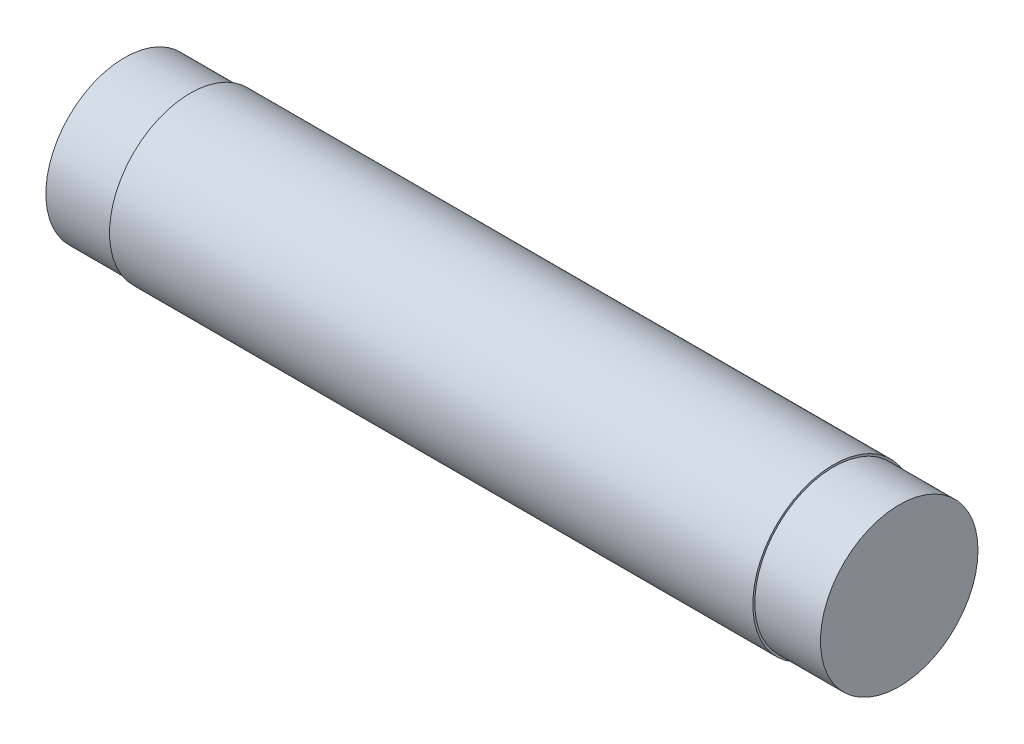
ISO-10303-21;
HEADER;
FILE_DESCRIPTION(('STEP AP214'),'2;1');
FILE_NAME('part.step','',(''),(''),'','','');
FILE_SCHEMA(('AUTOMOTIVE_DESIGN { 1 0 10303 214 1 1 1 1 }'));
ENDSEC;
DATA;
#1=APPLICATION_CONTEXT('core data for automotive mechanical design processes');
#2=APPLICATION_PROTOCOL_DEFINITION('international standard','automotive_design',2000,#1);
#3=PRODUCT_CONTEXT('',#1,'mechanical');
#4=PRODUCT('Part','Part','',(#3));
#5=PRODUCT_RELATED_PRODUCT_CATEGORY('part','',(#4));
#6=PRODUCT_DEFINITION_FORMATION('','',#4);
#7=PRODUCT_DEFINITION_CONTEXT('part definition',#1,'design');
#8=PRODUCT_DEFINITION('design','',#6,#7);
#9=PRODUCT_DEFINITION_SHAPE('','',#8);
#10=(LENGTH_UNIT() NAMED_UNIT(*) SI_UNIT(.MILLI.,.METRE.));
#11=(NAMED_UNIT(*) PLANE_ANGLE_UNIT() SI_UNIT($,.RADIAN.));
#12=(NAMED_UNIT(*) SI_UNIT($,.STERADIAN.) SOLID_ANGLE_UNIT());
#13=UNCERTAINTY_MEASURE_WITH_UNIT(LENGTH_MEASURE(1.E-05),#10,'distance_accuracy_value','');
#14=(GEOMETRIC_REPRESENTATION_CONTEXT(3) GLOBAL_UNCERTAINTY_ASSIGNED_CONTEXT((#13)) GLOBAL_UNIT_ASSIGNED_CONTEXT((#10,
#11,#12)) REPRESENTATION_CONTEXT('',''));
#15=CARTESIAN_POINT('',(0.,0.,0.));
#16=DIRECTION('',(0.,0.,1.));
#17=DIRECTION('',(1.,0.,0.));
#18=AXIS2_PLACEMENT_3D('',#15,#16,#17);
#19=CARTESIAN_POINT('',(59.,0.,0.));
#20=DIRECTION('',(-1.,0.,0.));
#21=DIRECTION('',(0.,0.,1.));
#22=AXIS2_PLACEMENT_3D('',#19,#20,#21);
#23=CYLINDRICAL_SURFACE('',#22,6.15);
#24=CARTESIAN_POINT('',(54.,0.,0.));
#25=DIRECTION('',(1.,0.,0.));
#26=DIRECTION('',(0.,0.,-1.));
#27=AXIS2_PLACEMENT_3D('',#24,#25,#26);
#28=CIRCLE('',#27,6.15);
#29=CARTESIAN_POINT('',(54.,0.,-6.15));
#30=VERTEX_POINT('',#29);
#31=EDGE_CURVE('E10',#30,#30,#28,.T.);
#32=ORIENTED_EDGE('',*,*,#31,.F.);
#33=EDGE_LOOP('',(#32));
#34=FACE_BOUND('',#33,.T.);
#35=CARTESIAN_POINT('',(5.,0.,0.));
#36=DIRECTION('',(1.,0.,0.));
#37=DIRECTION('',(0.,0.,-1.));
#38=AXIS2_PLACEMENT_3D('',#35,#36,#37);
#39=CIRCLE('',#38,6.15);
#40=CARTESIAN_POINT('',(5.,0.,-6.15));
#41=VERTEX_POINT('',#40);
#42=EDGE_CURVE('E49',#41,#41,#39,.T.);
#43=ORIENTED_EDGE('',*,*,#42,.T.);
#44=EDGE_LOOP('',(#43));
#45=FACE_BOUND('',#44,.T.);
#46=ADVANCED_FACE('F32',(#34,#45),#23,.T.);
#47=CARTESIAN_POINT('',(54.,0.,0.));
#48=DIRECTION('',(1.,0.,0.));
#49=DIRECTION('',(0.,0.,-1.));
#50=AXIS2_PLACEMENT_3D('',#47,#48,#49);
#51=CYLINDRICAL_SURFACE('',#50,6.);
#52=CARTESIAN_POINT('',(54.,0.,0.));
#53=DIRECTION('',(1.,0.,0.));
#54=DIRECTION('',(0.,0.,-1.));
#55=AXIS2_PLACEMENT_3D('',#52,#53,#54);
#56=CIRCLE('',#55,6.);
#57=CARTESIAN_POINT('',(54.,0.,-6.));
#58=VERTEX_POINT('',#57);
#59=EDGE_CURVE('E39',#58,#58,#56,.T.);
#60=ORIENTED_EDGE('',*,*,#59,.T.);
#61=EDGE_LOOP('',(#60));
#62=FACE_BOUND('',#61,.T.);
#63=CARTESIAN_POINT('',(59.,0.,0.));
#64=DIRECTION('',(1.,0.,0.));
#65=DIRECTION('',(0.,0.,-1.));
#66=AXIS2_PLACEMENT_3D('',#63,#64,#65);
#67=CIRCLE('',#66,6.);
#68=CARTESIAN_POINT('',(59.,0.,-6.));
#69=VERTEX_POINT('',#68);
#70=EDGE_CURVE('E35',#69,#69,#67,.T.);
#71=ORIENTED_EDGE('',*,*,#70,.F.);
#72=EDGE_LOOP('',(#71));
#73=FACE_BOUND('',#72,.T.);
#74=ADVANCED_FACE('F73',(#62,#73),#51,.T.);
#75=CARTESIAN_POINT('',(54.,0.,0.));
#76=DIRECTION('',(1.,0.,0.));
#77=DIRECTION('',(0.,0.,-1.));
#78=AXIS2_PLACEMENT_3D('',#75,#76,#77);
#79=PLANE('',#78);
#80=ORIENTED_EDGE('',*,*,#59,.F.);
#81=EDGE_LOOP('',(#80));
#82=FACE_BOUND('',#81,.T.);
#83=ORIENTED_EDGE('',*,*,#31,.T.);
#84=EDGE_LOOP('',(#83));
#85=FACE_BOUND('',#84,.T.);
#86=ADVANCED_FACE('F78',(#82,#85),#79,.T.);
#87=CARTESIAN_POINT('',(59.,0.,0.));
#88=DIRECTION('',(1.,0.,0.));
#89=DIRECTION('',(0.,0.,-1.));
#90=AXIS2_PLACEMENT_3D('',#87,#88,#89);
#91=PLANE('',#90);
#92=ORIENTED_EDGE('',*,*,#70,.T.);
#93=EDGE_LOOP('',(#92));
#94=FACE_BOUND('',#93,.T.);
#95=ADVANCED_FACE('F61',(#94),#91,.T.);
#96=CARTESIAN_POINT('',(5.,0.,0.));
#97=DIRECTION('',(-1.,0.,0.));
#98=DIRECTION('',(0.,0.,1.));
#99=AXIS2_PLACEMENT_3D('',#96,#97,#98);
#100=CYLINDRICAL_SURFACE('',#99,6.);
#101=CARTESIAN_POINT('',(5.,0.,0.));
#102=DIRECTION('',(1.,0.,0.));
#103=DIRECTION('',(0.,0.,-1.));
#104=AXIS2_PLACEMENT_3D('',#101,#102,#103);
#105=CIRCLE('',#104,6.);
#106=CARTESIAN_POINT('',(5.,0.,-6.));
#107=VERTEX_POINT('',#106);
#108=EDGE_CURVE('E48',#107,#107,#105,.T.);
#109=ORIENTED_EDGE('',*,*,#108,.F.);
#110=EDGE_LOOP('',(#109));
#111=FACE_BOUND('',#110,.T.);
#112=CARTESIAN_POINT('',(0.,0.,0.));
#113=DIRECTION('',(1.,0.,0.));
#114=DIRECTION('',(0.,0.,-1.));
#115=AXIS2_PLACEMENT_3D('',#112,#113,#114);
#116=CIRCLE('',#115,6.);
#117=CARTESIAN_POINT('',(0.,0.,-6.));
#118=VERTEX_POINT('',#117);
#119=EDGE_CURVE('E45',#118,#118,#116,.T.);
#120=ORIENTED_EDGE('',*,*,#119,.T.);
#121=EDGE_LOOP('',(#120));
#122=FACE_BOUND('',#121,.T.);
#123=ADVANCED_FACE('F58',(#111,#122),#100,.T.);
#124=CARTESIAN_POINT('',(5.,0.,0.));
#125=DIRECTION('',(-1.,0.,0.));
#126=DIRECTION('',(0.,0.,-1.));
#127=AXIS2_PLACEMENT_3D('',#124,#125,#126);
#128=PLANE('',#127);
#129=ORIENTED_EDGE('',*,*,#108,.T.);
#130=EDGE_LOOP('',(#129));
#131=FACE_BOUND('',#130,.T.);
#132=ORIENTED_EDGE('',*,*,#42,.F.);
#133=EDGE_LOOP('',(#132));
#134=FACE_BOUND('',#133,.T.);
#135=ADVANCED_FACE('F55',(#131,#134),#128,.T.);
#136=CARTESIAN_POINT('',(0.,0.,0.));
#137=DIRECTION('',(1.,0.,0.));
#138=DIRECTION('',(0.,0.,-1.));
#139=AXIS2_PLACEMENT_3D('',#136,#137,#138);
#140=PLANE('',#139);
#141=ORIENTED_EDGE('',*,*,#119,.F.);
#142=EDGE_LOOP('',(#141));
#143=FACE_BOUND('',#142,.T.);
#144=ADVANCED_FACE('F65',(#143),#140,.F.);
#145=CLOSED_SHELL('',(#46,#74,#86,#95,#123,#135,#144));
#146=MANIFOLD_SOLID_BREP('B2',#145);
#147=ADVANCED_BREP_SHAPE_REPRESENTATION('',(#18,#146),#14);
#148=SHAPE_DEFINITION_REPRESENTATION(#9,#147);
ENDSEC;
END-ISO-10303-21;
